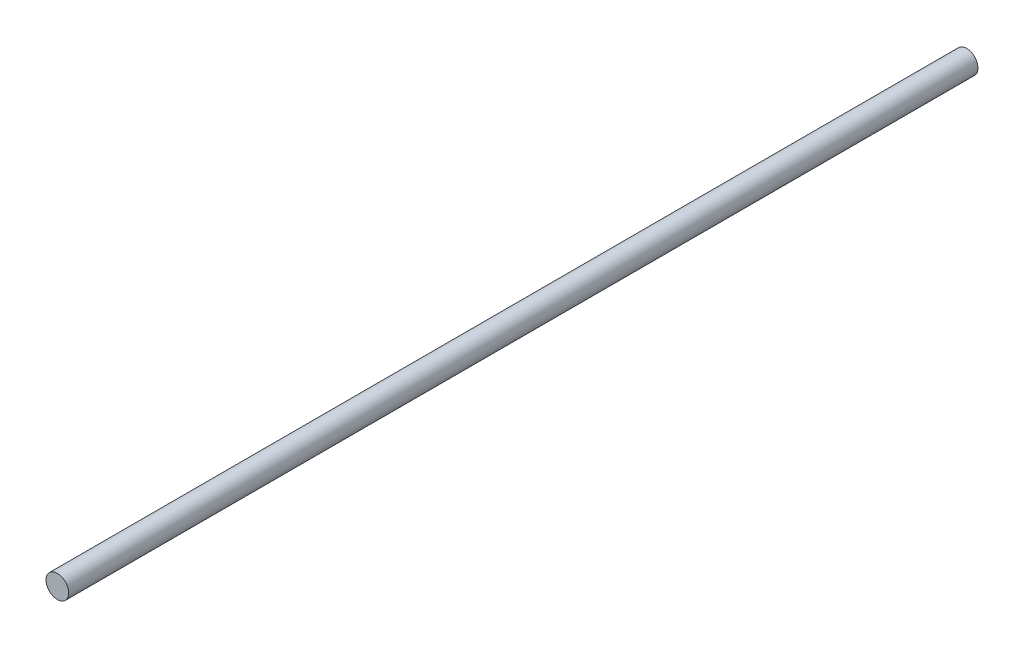
ISO-10303-21;
HEADER;
FILE_DESCRIPTION(('STEP AP214'),'2;1');
FILE_NAME('part.step','',(''),(''),'','','');
FILE_SCHEMA(('AUTOMOTIVE_DESIGN { 1 0 10303 214 1 1 1 1 }'));
ENDSEC;
DATA;
#1=APPLICATION_CONTEXT('core data for automotive mechanical design processes');
#2=APPLICATION_PROTOCOL_DEFINITION('international standard','automotive_design',2000,#1);
#3=PRODUCT_CONTEXT('',#1,'mechanical');
#4=PRODUCT('Part','Part','',(#3));
#5=PRODUCT_RELATED_PRODUCT_CATEGORY('part','',(#4));
#6=PRODUCT_DEFINITION_FORMATION('','',#4);
#7=PRODUCT_DEFINITION_CONTEXT('part definition',#1,'design');
#8=PRODUCT_DEFINITION('design','',#6,#7);
#9=PRODUCT_DEFINITION_SHAPE('','',#8);
#10=(LENGTH_UNIT() NAMED_UNIT(*) SI_UNIT(.MILLI.,.METRE.));
#11=(NAMED_UNIT(*) PLANE_ANGLE_UNIT() SI_UNIT($,.RADIAN.));
#12=(NAMED_UNIT(*) SI_UNIT($,.STERADIAN.) SOLID_ANGLE_UNIT());
#13=UNCERTAINTY_MEASURE_WITH_UNIT(LENGTH_MEASURE(1.E-05),#10,'distance_accuracy_value','');
#14=(GEOMETRIC_REPRESENTATION_CONTEXT(3) GLOBAL_UNCERTAINTY_ASSIGNED_CONTEXT((#13)) GLOBAL_UNIT_ASSIGNED_CONTEXT((#10,
#11,#12)) REPRESENTATION_CONTEXT('',''));
#15=CARTESIAN_POINT('',(0.,0.,0.));
#16=DIRECTION('',(0.,0.,1.));
#17=DIRECTION('',(1.,0.,0.));
#18=AXIS2_PLACEMENT_3D('',#15,#16,#17);
#19=CARTESIAN_POINT('',(0.,0.,200.));
#20=DIRECTION('',(0.,0.,-1.));
#21=DIRECTION('',(-1.,0.,0.));
#22=AXIS2_PLACEMENT_3D('',#19,#20,#21);
#23=CYLINDRICAL_SURFACE('',#22,2.5);
#24=CARTESIAN_POINT('',(0.,0.,200.));
#25=DIRECTION('',(0.,0.,1.));
#26=DIRECTION('',(1.,0.,0.));
#27=AXIS2_PLACEMENT_3D('',#24,#25,#26);
#28=CIRCLE('',#27,2.5);
#29=CARTESIAN_POINT('',(2.5,0.,200.));
#30=VERTEX_POINT('',#29);
#31=EDGE_CURVE('E10',#30,#30,#28,.T.);
#32=ORIENTED_EDGE('',*,*,#31,.F.);
#33=EDGE_LOOP('',(#32));
#34=FACE_BOUND('',#33,.T.);
#35=CARTESIAN_POINT('',(0.,0.,0.));
#36=DIRECTION('',(0.,0.,1.));
#37=DIRECTION('',(1.,0.,0.));
#38=AXIS2_PLACEMENT_3D('',#35,#36,#37);
#39=CIRCLE('',#38,2.5);
#40=CARTESIAN_POINT('',(2.5,0.,0.));
#41=VERTEX_POINT('',#40);
#42=EDGE_CURVE('E34',#41,#41,#39,.T.);
#43=ORIENTED_EDGE('',*,*,#42,.T.);
#44=EDGE_LOOP('',(#43));
#45=FACE_BOUND('',#44,.T.);
#46=ADVANCED_FACE('F31',(#34,#45),#23,.T.);
#47=CARTESIAN_POINT('',(0.,0.,200.));
#48=DIRECTION('',(0.,0.,1.));
#49=DIRECTION('',(1.,0.,0.));
#50=AXIS2_PLACEMENT_3D('',#47,#48,#49);
#51=PLANE('',#50);
#52=ORIENTED_EDGE('',*,*,#31,.T.);
#53=EDGE_LOOP('',(#52));
#54=FACE_BOUND('',#53,.T.);
#55=ADVANCED_FACE('F46',(#54),#51,.T.);
#56=CARTESIAN_POINT('',(0.,0.,0.));
#57=DIRECTION('',(0.,0.,1.));
#58=DIRECTION('',(1.,0.,0.));
#59=AXIS2_PLACEMENT_3D('',#56,#57,#58);
#60=PLANE('',#59);
#61=ORIENTED_EDGE('',*,*,#42,.F.);
#62=EDGE_LOOP('',(#61));
#63=FACE_BOUND('',#62,.T.);
#64=ADVANCED_FACE('F44',(#63),#60,.F.);
#65=CLOSED_SHELL('',(#46,#55,#64));
#66=MANIFOLD_SOLID_BREP('B2',#65);
#67=ADVANCED_BREP_SHAPE_REPRESENTATION('',(#18,#66),#14);
#68=SHAPE_DEFINITION_REPRESENTATION(#9,#67);
ENDSEC;
END-ISO-10303-21;
